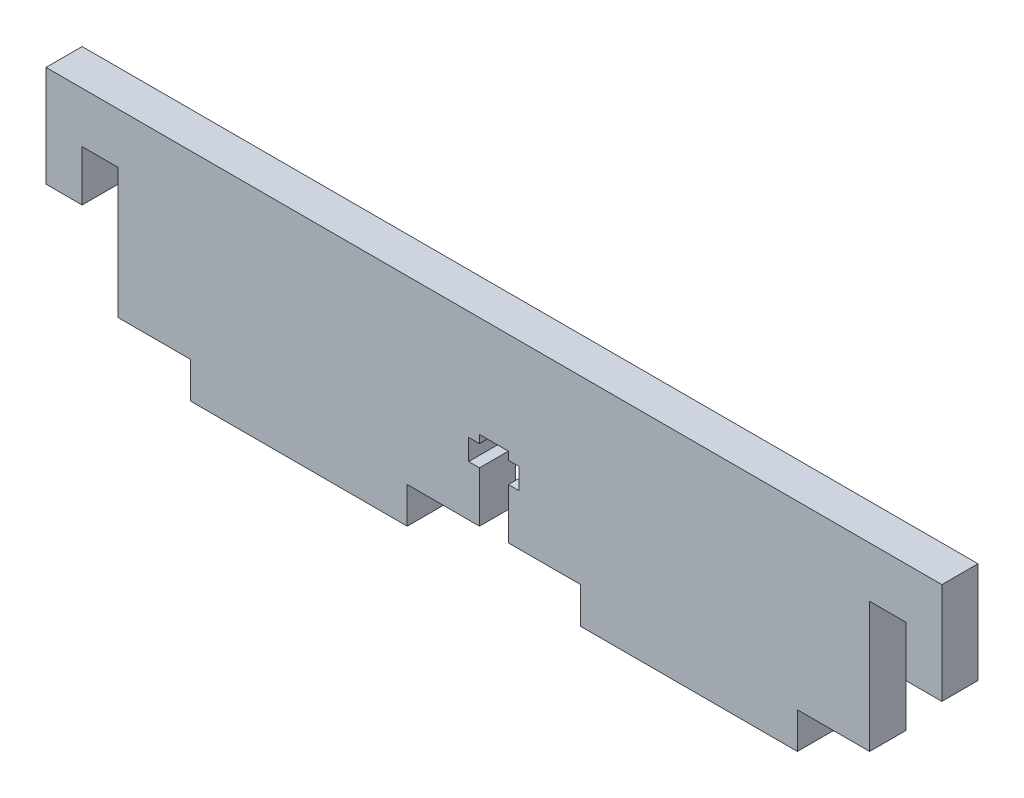
ISO-10303-21;
HEADER;
FILE_DESCRIPTION(('STEP AP214'),'2;1');
FILE_NAME('part.step','',(''),(''),'','','');
FILE_SCHEMA(('AUTOMOTIVE_DESIGN { 1 0 10303 214 1 1 1 1 }'));
ENDSEC;
DATA;
#1=APPLICATION_CONTEXT('core data for automotive mechanical design processes');
#2=APPLICATION_PROTOCOL_DEFINITION('international standard','automotive_design',2000,#1);
#3=PRODUCT_CONTEXT('',#1,'mechanical');
#4=PRODUCT('Part','Part','',(#3));
#5=PRODUCT_RELATED_PRODUCT_CATEGORY('part','',(#4));
#6=PRODUCT_DEFINITION_FORMATION('','',#4);
#7=PRODUCT_DEFINITION_CONTEXT('part definition',#1,'design');
#8=PRODUCT_DEFINITION('design','',#6,#7);
#9=PRODUCT_DEFINITION_SHAPE('','',#8);
#10=(LENGTH_UNIT() NAMED_UNIT(*) SI_UNIT(.MILLI.,.METRE.));
#11=(NAMED_UNIT(*) PLANE_ANGLE_UNIT() SI_UNIT($,.RADIAN.));
#12=(NAMED_UNIT(*) SI_UNIT($,.STERADIAN.) SOLID_ANGLE_UNIT());
#13=UNCERTAINTY_MEASURE_WITH_UNIT(LENGTH_MEASURE(1.E-05),#10,'distance_accuracy_value','');
#14=(GEOMETRIC_REPRESENTATION_CONTEXT(3) GLOBAL_UNCERTAINTY_ASSIGNED_CONTEXT((#13)) GLOBAL_UNIT_ASSIGNED_CONTEXT((#10,
#11,#12)) REPRESENTATION_CONTEXT('',''));
#15=CARTESIAN_POINT('',(0.,0.,0.));
#16=DIRECTION('',(0.,0.,1.));
#17=DIRECTION('',(1.,0.,0.));
#18=AXIS2_PLACEMENT_3D('',#15,#16,#17);
#19=CARTESIAN_POINT('',(0.,25.,5.));
#20=DIRECTION('',(0.,-1.,0.));
#21=DIRECTION('',(0.,0.,-1.));
#22=AXIS2_PLACEMENT_3D('',#19,#20,#21);
#23=PLANE('',#22);
#24=DIRECTION('',(-1.,0.,0.));
#25=VECTOR('',#24,1.);
#26=CARTESIAN_POINT('',(0.,25.,0.));
#27=LINE('',#26,#25);
#28=CARTESIAN_POINT('',(10.,25.,0.));
#29=VERTEX_POINT('',#28);
#30=CARTESIAN_POINT('',(-114.,25.,0.));
#31=VERTEX_POINT('',#30);
#32=EDGE_CURVE('E287',#29,#31,#27,.T.);
#33=ORIENTED_EDGE('',*,*,#32,.T.);
#34=DIRECTION('',(0.,0.,-1.));
#35=VECTOR('',#34,1.);
#36=CARTESIAN_POINT('',(-114.,25.,5.));
#37=LINE('',#36,#35);
#38=CARTESIAN_POINT('',(-114.,25.,5.));
#39=VERTEX_POINT('',#38);
#40=EDGE_CURVE('E11',#39,#31,#37,.T.);
#41=ORIENTED_EDGE('',*,*,#40,.F.);
#42=DIRECTION('',(-1.,0.,0.));
#43=VECTOR('',#42,1.);
#44=CARTESIAN_POINT('',(0.,25.,5.));
#45=LINE('',#44,#43);
#46=CARTESIAN_POINT('',(10.,25.,5.));
#47=VERTEX_POINT('',#46);
#48=EDGE_CURVE('E392',#47,#39,#45,.T.);
#49=ORIENTED_EDGE('',*,*,#48,.F.);
#50=DIRECTION('',(0.,0.,-1.));
#51=VECTOR('',#50,1.);
#52=CARTESIAN_POINT('',(10.,25.,5.));
#53=LINE('',#52,#51);
#54=EDGE_CURVE('E58',#47,#29,#53,.T.);
#55=ORIENTED_EDGE('',*,*,#54,.T.);
#56=EDGE_LOOP('',(#33,#41,#49,#55));
#57=FACE_BOUND('',#56,.T.);
#58=ADVANCED_FACE('F41',(#57),#23,.F.);
#59=CARTESIAN_POINT('',(-114.,0.,5.));
#60=DIRECTION('',(1.,0.,0.));
#61=DIRECTION('',(0.,0.,-1.));
#62=AXIS2_PLACEMENT_3D('',#59,#60,#61);
#63=PLANE('',#62);
#64=DIRECTION('',(0.,-1.,0.));
#65=VECTOR('',#64,1.);
#66=CARTESIAN_POINT('',(-114.,0.,0.));
#67=LINE('',#66,#65);
#68=CARTESIAN_POINT('',(-114.,11.,0.));
#69=VERTEX_POINT('',#68);
#70=EDGE_CURVE('E290',#31,#69,#67,.T.);
#71=ORIENTED_EDGE('',*,*,#70,.T.);
#72=DIRECTION('',(0.,0.,-1.));
#73=VECTOR('',#72,1.);
#74=CARTESIAN_POINT('',(-114.,11.,5.));
#75=LINE('',#74,#73);
#76=CARTESIAN_POINT('',(-114.,11.,5.));
#77=VERTEX_POINT('',#76);
#78=EDGE_CURVE('E50',#77,#69,#75,.T.);
#79=ORIENTED_EDGE('',*,*,#78,.F.);
#80=DIRECTION('',(0.,-1.,0.));
#81=VECTOR('',#80,1.);
#82=CARTESIAN_POINT('',(-114.,0.,5.));
#83=LINE('',#82,#81);
#84=EDGE_CURVE('E168',#39,#77,#83,.T.);
#85=ORIENTED_EDGE('',*,*,#84,.F.);
#86=ORIENTED_EDGE('',*,*,#40,.T.);
#87=EDGE_LOOP('',(#71,#79,#85,#86));
#88=FACE_BOUND('',#87,.T.);
#89=ADVANCED_FACE('F613',(#88),#63,.F.);
#90=CARTESIAN_POINT('',(0.,11.,5.));
#91=DIRECTION('',(0.,1.,0.));
#92=DIRECTION('',(0.,0.,1.));
#93=AXIS2_PLACEMENT_3D('',#90,#91,#92);
#94=PLANE('',#93);
#95=DIRECTION('',(1.,0.,0.));
#96=VECTOR('',#95,1.);
#97=CARTESIAN_POINT('',(0.,11.,0.));
#98=LINE('',#97,#96);
#99=CARTESIAN_POINT('',(-109.,11.,0.));
#100=VERTEX_POINT('',#99);
#101=EDGE_CURVE('E293',#69,#100,#98,.T.);
#102=ORIENTED_EDGE('',*,*,#101,.T.);
#103=DIRECTION('',(0.,0.,-1.));
#104=VECTOR('',#103,1.);
#105=CARTESIAN_POINT('',(-109.,11.,5.));
#106=LINE('',#105,#104);
#107=CARTESIAN_POINT('',(-109.,11.,5.));
#108=VERTEX_POINT('',#107);
#109=EDGE_CURVE('E480',#108,#100,#106,.T.);
#110=ORIENTED_EDGE('',*,*,#109,.F.);
#111=DIRECTION('',(1.,0.,0.));
#112=VECTOR('',#111,1.);
#113=CARTESIAN_POINT('',(0.,11.,5.));
#114=LINE('',#113,#112);
#115=EDGE_CURVE('E489',#77,#108,#114,.T.);
#116=ORIENTED_EDGE('',*,*,#115,.F.);
#117=ORIENTED_EDGE('',*,*,#78,.T.);
#118=EDGE_LOOP('',(#102,#110,#116,#117));
#119=FACE_BOUND('',#118,.T.);
#120=ADVANCED_FACE('F487',(#119),#94,.F.);
#121=CARTESIAN_POINT('',(-109.,0.,5.));
#122=DIRECTION('',(1.,0.,0.));
#123=DIRECTION('',(0.,0.,-1.));
#124=AXIS2_PLACEMENT_3D('',#121,#122,#123);
#125=PLANE('',#124);
#126=DIRECTION('',(0.,-1.,0.));
#127=VECTOR('',#126,1.);
#128=CARTESIAN_POINT('',(-109.,0.,0.));
#129=LINE('',#128,#127);
#130=CARTESIAN_POINT('',(-109.,18.,0.));
#131=VERTEX_POINT('',#130);
#132=EDGE_CURVE('E297',#131,#100,#129,.T.);
#133=ORIENTED_EDGE('',*,*,#132,.F.);
#134=DIRECTION('',(0.,0.,-1.));
#135=VECTOR('',#134,1.);
#136=CARTESIAN_POINT('',(-109.,18.,5.));
#137=LINE('',#136,#135);
#138=CARTESIAN_POINT('',(-109.,18.,5.));
#139=VERTEX_POINT('',#138);
#140=EDGE_CURVE('E477',#139,#131,#137,.T.);
#141=ORIENTED_EDGE('',*,*,#140,.F.);
#142=DIRECTION('',(0.,-1.,0.));
#143=VECTOR('',#142,1.);
#144=CARTESIAN_POINT('',(-109.,0.,5.));
#145=LINE('',#144,#143);
#146=EDGE_CURVE('E498',#139,#108,#145,.T.);
#147=ORIENTED_EDGE('',*,*,#146,.T.);
#148=ORIENTED_EDGE('',*,*,#109,.T.);
#149=EDGE_LOOP('',(#133,#141,#147,#148));
#150=FACE_BOUND('',#149,.T.);
#151=ADVANCED_FACE('F495',(#150),#125,.T.);
#152=CARTESIAN_POINT('',(0.,18.0000000000001,5.));
#153=DIRECTION('',(0.,-1.,0.));
#154=DIRECTION('',(1.,0.,0.));
#155=AXIS2_PLACEMENT_3D('',#152,#153,#154);
#156=PLANE('',#155);
#157=DIRECTION('',(-1.,0.,0.));
#158=VECTOR('',#157,1.);
#159=CARTESIAN_POINT('',(0.,18.0000000000001,0.));
#160=LINE('',#159,#158);
#161=CARTESIAN_POINT('',(-104.,18.,0.));
#162=VERTEX_POINT('',#161);
#163=EDGE_CURVE('E301',#162,#131,#160,.T.);
#164=ORIENTED_EDGE('',*,*,#163,.F.);
#165=DIRECTION('',(0.,0.,-1.));
#166=VECTOR('',#165,1.);
#167=CARTESIAN_POINT('',(-104.,18.,5.));
#168=LINE('',#167,#166);
#169=CARTESIAN_POINT('',(-104.,18.,5.));
#170=VERTEX_POINT('',#169);
#171=EDGE_CURVE('E474',#170,#162,#168,.T.);
#172=ORIENTED_EDGE('',*,*,#171,.F.);
#173=DIRECTION('',(-1.,0.,0.));
#174=VECTOR('',#173,1.);
#175=CARTESIAN_POINT('',(0.,18.0000000000001,5.));
#176=LINE('',#175,#174);
#177=EDGE_CURVE('E502',#170,#139,#176,.T.);
#178=ORIENTED_EDGE('',*,*,#177,.T.);
#179=ORIENTED_EDGE('',*,*,#140,.T.);
#180=EDGE_LOOP('',(#164,#172,#178,#179));
#181=FACE_BOUND('',#180,.T.);
#182=ADVANCED_FACE('F623',(#181),#156,.T.);
#183=CARTESIAN_POINT('',(-104.,0.,5.));
#184=DIRECTION('',(-1.,0.,0.));
#185=DIRECTION('',(0.,-1.,0.));
#186=AXIS2_PLACEMENT_3D('',#183,#184,#185);
#187=PLANE('',#186);
#188=DIRECTION('',(0.,1.,0.));
#189=VECTOR('',#188,1.);
#190=CARTESIAN_POINT('',(-104.,0.,0.));
#191=LINE('',#190,#189);
#192=CARTESIAN_POINT('',(-104.,0.,0.));
#193=VERTEX_POINT('',#192);
#194=EDGE_CURVE('E305',#193,#162,#191,.T.);
#195=ORIENTED_EDGE('',*,*,#194,.F.);
#196=DIRECTION('',(0.,0.,-1.));
#197=VECTOR('',#196,1.);
#198=CARTESIAN_POINT('',(-104.,0.,5.));
#199=LINE('',#198,#197);
#200=CARTESIAN_POINT('',(-104.,0.,5.));
#201=VERTEX_POINT('',#200);
#202=EDGE_CURVE('E471',#201,#193,#199,.T.);
#203=ORIENTED_EDGE('',*,*,#202,.F.);
#204=DIRECTION('',(0.,1.,0.));
#205=VECTOR('',#204,1.);
#206=CARTESIAN_POINT('',(-104.,0.,5.));
#207=LINE('',#206,#205);
#208=EDGE_CURVE('E506',#201,#170,#207,.T.);
#209=ORIENTED_EDGE('',*,*,#208,.T.);
#210=ORIENTED_EDGE('',*,*,#171,.T.);
#211=EDGE_LOOP('',(#195,#203,#209,#210));
#212=FACE_BOUND('',#211,.T.);
#213=ADVANCED_FACE('F626',(#212),#187,.T.);
#214=CARTESIAN_POINT('',(0.,0.,5.));
#215=DIRECTION('',(0.,-1.,0.));
#216=DIRECTION('',(1.,0.,0.));
#217=AXIS2_PLACEMENT_3D('',#214,#215,#216);
#218=PLANE('',#217);
#219=DIRECTION('',(-1.,0.,0.));
#220=VECTOR('',#219,1.);
#221=CARTESIAN_POINT('',(0.,0.,0.));
#222=LINE('',#221,#220);
#223=CARTESIAN_POINT('',(-94.,0.,0.));
#224=VERTEX_POINT('',#223);
#225=EDGE_CURVE('E309',#224,#193,#222,.T.);
#226=ORIENTED_EDGE('',*,*,#225,.F.);
#227=DIRECTION('',(0.,0.,-1.));
#228=VECTOR('',#227,1.);
#229=CARTESIAN_POINT('',(-94.,0.,5.));
#230=LINE('',#229,#228);
#231=CARTESIAN_POINT('',(-94.,0.,5.));
#232=VERTEX_POINT('',#231);
#233=EDGE_CURVE('E468',#232,#224,#230,.T.);
#234=ORIENTED_EDGE('',*,*,#233,.F.);
#235=DIRECTION('',(-1.,0.,0.));
#236=VECTOR('',#235,1.);
#237=CARTESIAN_POINT('',(0.,0.,5.));
#238=LINE('',#237,#236);
#239=EDGE_CURVE('E514',#232,#201,#238,.T.);
#240=ORIENTED_EDGE('',*,*,#239,.T.);
#241=ORIENTED_EDGE('',*,*,#202,.T.);
#242=EDGE_LOOP('',(#226,#234,#240,#241));
#243=FACE_BOUND('',#242,.T.);
#244=ADVANCED_FACE('F630',(#243),#218,.T.);
#245=CARTESIAN_POINT('',(-94.,0.,5.));
#246=DIRECTION('',(1.,0.,0.));
#247=DIRECTION('',(0.,0.,-1.));
#248=AXIS2_PLACEMENT_3D('',#245,#246,#247);
#249=PLANE('',#248);
#250=DIRECTION('',(0.,-1.,0.));
#251=VECTOR('',#250,1.);
#252=CARTESIAN_POINT('',(-94.,0.,0.));
#253=LINE('',#252,#251);
#254=CARTESIAN_POINT('',(-94.,-5.00000000000002,0.));
#255=VERTEX_POINT('',#254);
#256=EDGE_CURVE('E313',#224,#255,#253,.T.);
#257=ORIENTED_EDGE('',*,*,#256,.T.);
#258=DIRECTION('',(0.,0.,-1.));
#259=VECTOR('',#258,1.);
#260=CARTESIAN_POINT('',(-94.,-5.00000000000002,5.));
#261=LINE('',#260,#259);
#262=CARTESIAN_POINT('',(-94.,-5.00000000000002,5.));
#263=VERTEX_POINT('',#262);
#264=EDGE_CURVE('E464',#263,#255,#261,.T.);
#265=ORIENTED_EDGE('',*,*,#264,.F.);
#266=DIRECTION('',(0.,-1.,0.));
#267=VECTOR('',#266,1.);
#268=CARTESIAN_POINT('',(-94.,0.,5.));
#269=LINE('',#268,#267);
#270=EDGE_CURVE('E518',#232,#263,#269,.T.);
#271=ORIENTED_EDGE('',*,*,#270,.F.);
#272=ORIENTED_EDGE('',*,*,#233,.T.);
#273=EDGE_LOOP('',(#257,#265,#271,#272));
#274=FACE_BOUND('',#273,.T.);
#275=ADVANCED_FACE('F632',(#274),#249,.F.);
#276=CARTESIAN_POINT('',(0.,-5.00000000000002,5.));
#277=DIRECTION('',(0.,1.,0.));
#278=DIRECTION('',(0.,0.,1.));
#279=AXIS2_PLACEMENT_3D('',#276,#277,#278);
#280=PLANE('',#279);
#281=DIRECTION('',(1.,0.,0.));
#282=VECTOR('',#281,1.);
#283=CARTESIAN_POINT('',(0.,-5.00000000000002,0.));
#284=LINE('',#283,#282);
#285=CARTESIAN_POINT('',(-64.,-5.00000000000002,0.));
#286=VERTEX_POINT('',#285);
#287=EDGE_CURVE('E317',#255,#286,#284,.T.);
#288=ORIENTED_EDGE('',*,*,#287,.T.);
#289=DIRECTION('',(0.,0.,-1.));
#290=VECTOR('',#289,1.);
#291=CARTESIAN_POINT('',(-64.,-5.00000000000002,5.));
#292=LINE('',#291,#290);
#293=CARTESIAN_POINT('',(-64.,-5.00000000000002,5.));
#294=VERTEX_POINT('',#293);
#295=EDGE_CURVE('E461',#294,#286,#292,.T.);
#296=ORIENTED_EDGE('',*,*,#295,.F.);
#297=DIRECTION('',(1.,0.,0.));
#298=VECTOR('',#297,1.);
#299=CARTESIAN_POINT('',(0.,-5.00000000000002,5.));
#300=LINE('',#299,#298);
#301=EDGE_CURVE('E522',#263,#294,#300,.T.);
#302=ORIENTED_EDGE('',*,*,#301,.F.);
#303=ORIENTED_EDGE('',*,*,#264,.T.);
#304=EDGE_LOOP('',(#288,#296,#302,#303));
#305=FACE_BOUND('',#304,.T.);
#306=ADVANCED_FACE('F635',(#305),#280,.F.);
#307=CARTESIAN_POINT('',(-64.,0.,5.));
#308=DIRECTION('',(1.,0.,0.));
#309=DIRECTION('',(0.,0.,-1.));
#310=AXIS2_PLACEMENT_3D('',#307,#308,#309);
#311=PLANE('',#310);
#312=DIRECTION('',(0.,-1.,0.));
#313=VECTOR('',#312,1.);
#314=CARTESIAN_POINT('',(-64.,0.,0.));
#315=LINE('',#314,#313);
#316=CARTESIAN_POINT('',(-64.,0.,0.));
#317=VERTEX_POINT('',#316);
#318=EDGE_CURVE('E321',#317,#286,#315,.T.);
#319=ORIENTED_EDGE('',*,*,#318,.F.);
#320=DIRECTION('',(0.,0.,-1.));
#321=VECTOR('',#320,1.);
#322=CARTESIAN_POINT('',(-64.,0.,5.));
#323=LINE('',#322,#321);
#324=CARTESIAN_POINT('',(-64.,0.,5.));
#325=VERTEX_POINT('',#324);
#326=EDGE_CURVE('E458',#325,#317,#323,.T.);
#327=ORIENTED_EDGE('',*,*,#326,.F.);
#328=DIRECTION('',(0.,-1.,0.));
#329=VECTOR('',#328,1.);
#330=CARTESIAN_POINT('',(-64.,0.,5.));
#331=LINE('',#330,#329);
#332=EDGE_CURVE('E525',#325,#294,#331,.T.);
#333=ORIENTED_EDGE('',*,*,#332,.T.);
#334=ORIENTED_EDGE('',*,*,#295,.T.);
#335=EDGE_LOOP('',(#319,#327,#333,#334));
#336=FACE_BOUND('',#335,.T.);
#337=ADVANCED_FACE('F599',(#336),#311,.T.);
#338=CARTESIAN_POINT('',(-54.,0.,0.));
#339=VERTEX_POINT('',#338);
#340=EDGE_CURVE('E314',#339,#317,#222,.T.);
#341=ORIENTED_EDGE('',*,*,#340,.F.);
#342=DIRECTION('',(0.,0.,-1.));
#343=VECTOR('',#342,1.);
#344=CARTESIAN_POINT('',(-54.,0.,5.));
#345=LINE('',#344,#343);
#346=CARTESIAN_POINT('',(-54.,0.,5.));
#347=VERTEX_POINT('',#346);
#348=EDGE_CURVE('E455',#347,#339,#345,.T.);
#349=ORIENTED_EDGE('',*,*,#348,.F.);
#350=EDGE_CURVE('E519',#347,#325,#238,.T.);
#351=ORIENTED_EDGE('',*,*,#350,.T.);
#352=ORIENTED_EDGE('',*,*,#326,.T.);
#353=EDGE_LOOP('',(#341,#349,#351,#352));
#354=FACE_BOUND('',#353,.T.);
#355=ADVANCED_FACE('F590',(#354),#218,.T.);
#356=CARTESIAN_POINT('',(-54.,0.,5.));
#357=DIRECTION('',(-1.,0.,0.));
#358=DIRECTION('',(0.,0.,1.));
#359=AXIS2_PLACEMENT_3D('',#356,#357,#358);
#360=PLANE('',#359);
#361=DIRECTION('',(0.,1.,0.));
#362=VECTOR('',#361,1.);
#363=CARTESIAN_POINT('',(-54.,0.,0.));
#364=LINE('',#363,#362);
#365=CARTESIAN_POINT('',(-54.,7.,0.));
#366=VERTEX_POINT('',#365);
#367=EDGE_CURVE('E325',#339,#366,#364,.T.);
#368=ORIENTED_EDGE('',*,*,#367,.T.);
#369=DIRECTION('',(0.,0.,-1.));
#370=VECTOR('',#369,1.);
#371=CARTESIAN_POINT('',(-54.,7.,5.));
#372=LINE('',#371,#370);
#373=CARTESIAN_POINT('',(-54.,7.,5.));
#374=VERTEX_POINT('',#373);
#375=EDGE_CURVE('E452',#374,#366,#372,.T.);
#376=ORIENTED_EDGE('',*,*,#375,.F.);
#377=DIRECTION('',(0.,1.,0.));
#378=VECTOR('',#377,1.);
#379=CARTESIAN_POINT('',(-54.,0.,5.));
#380=LINE('',#379,#378);
#381=EDGE_CURVE('E529',#347,#374,#380,.T.);
#382=ORIENTED_EDGE('',*,*,#381,.F.);
#383=ORIENTED_EDGE('',*,*,#348,.T.);
#384=EDGE_LOOP('',(#368,#376,#382,#383));
#385=FACE_BOUND('',#384,.T.);
#386=ADVANCED_FACE('F644',(#385),#360,.F.);
#387=CARTESIAN_POINT('',(0.,7.,5.));
#388=DIRECTION('',(0.,1.,0.));
#389=DIRECTION('',(0.,0.,1.));
#390=AXIS2_PLACEMENT_3D('',#387,#388,#389);
#391=PLANE('',#390);
#392=DIRECTION('',(1.,0.,0.));
#393=VECTOR('',#392,1.);
#394=CARTESIAN_POINT('',(0.,7.,0.));
#395=LINE('',#394,#393);
#396=CARTESIAN_POINT('',(-55.5,7.,0.));
#397=VERTEX_POINT('',#396);
#398=EDGE_CURVE('E329',#397,#366,#395,.T.);
#399=ORIENTED_EDGE('',*,*,#398,.F.);
#400=DIRECTION('',(0.,0.,-1.));
#401=VECTOR('',#400,1.);
#402=CARTESIAN_POINT('',(-55.5,7.,5.));
#403=LINE('',#402,#401);
#404=CARTESIAN_POINT('',(-55.5,7.,5.));
#405=VERTEX_POINT('',#404);
#406=EDGE_CURVE('E449',#405,#397,#403,.T.);
#407=ORIENTED_EDGE('',*,*,#406,.F.);
#408=DIRECTION('',(1.,0.,0.));
#409=VECTOR('',#408,1.);
#410=CARTESIAN_POINT('',(0.,7.,5.));
#411=LINE('',#410,#409);
#412=EDGE_CURVE('E532',#405,#374,#411,.T.);
#413=ORIENTED_EDGE('',*,*,#412,.T.);
#414=ORIENTED_EDGE('',*,*,#375,.T.);
#415=EDGE_LOOP('',(#399,#407,#413,#414));
#416=FACE_BOUND('',#415,.T.);
#417=ADVANCED_FACE('F645',(#416),#391,.T.);
#418=CARTESIAN_POINT('',(-55.5,0.,5.));
#419=DIRECTION('',(1.,0.,0.));
#420=DIRECTION('',(0.,0.,-1.));
#421=AXIS2_PLACEMENT_3D('',#418,#419,#420);
#422=PLANE('',#421);
#423=DIRECTION('',(0.,-1.,0.));
#424=VECTOR('',#423,1.);
#425=CARTESIAN_POINT('',(-55.5,0.,0.));
#426=LINE('',#425,#424);
#427=CARTESIAN_POINT('',(-55.5,9.9,0.));
#428=VERTEX_POINT('',#427);
#429=EDGE_CURVE('E334',#428,#397,#426,.T.);
#430=ORIENTED_EDGE('',*,*,#429,.F.);
#431=DIRECTION('',(0.,0.,-1.));
#432=VECTOR('',#431,1.);
#433=CARTESIAN_POINT('',(-55.5,9.9,5.));
#434=LINE('',#433,#432);
#435=CARTESIAN_POINT('',(-55.5,9.9,5.));
#436=VERTEX_POINT('',#435);
#437=EDGE_CURVE('E446',#436,#428,#434,.T.);
#438=ORIENTED_EDGE('',*,*,#437,.F.);
#439=DIRECTION('',(0.,-1.,0.));
#440=VECTOR('',#439,1.);
#441=CARTESIAN_POINT('',(-55.5,0.,5.));
#442=LINE('',#441,#440);
#443=EDGE_CURVE('E537',#436,#405,#442,.T.);
#444=ORIENTED_EDGE('',*,*,#443,.T.);
#445=ORIENTED_EDGE('',*,*,#406,.T.);
#446=EDGE_LOOP('',(#430,#438,#444,#445));
#447=FACE_BOUND('',#446,.T.);
#448=ADVANCED_FACE('F648',(#447),#422,.T.);
#449=CARTESIAN_POINT('',(0.,9.90000000000006,5.));
#450=DIRECTION('',(0.,1.,0.));
#451=DIRECTION('',(-1.,0.,0.));
#452=AXIS2_PLACEMENT_3D('',#449,#450,#451);
#453=PLANE('',#452);
#454=DIRECTION('',(1.,0.,0.));
#455=VECTOR('',#454,1.);
#456=CARTESIAN_POINT('',(0.,9.90000000000006,0.));
#457=LINE('',#456,#455);
#458=CARTESIAN_POINT('',(-54.,9.9,0.));
#459=VERTEX_POINT('',#458);
#460=EDGE_CURVE('E338',#428,#459,#457,.T.);
#461=ORIENTED_EDGE('',*,*,#460,.T.);
#462=DIRECTION('',(0.,0.,-1.));
#463=VECTOR('',#462,1.);
#464=CARTESIAN_POINT('',(-54.,9.9,5.));
#465=LINE('',#464,#463);
#466=CARTESIAN_POINT('',(-54.,9.9,5.));
#467=VERTEX_POINT('',#466);
#468=EDGE_CURVE('E442',#467,#459,#465,.T.);
#469=ORIENTED_EDGE('',*,*,#468,.F.);
#470=DIRECTION('',(1.,0.,0.));
#471=VECTOR('',#470,1.);
#472=CARTESIAN_POINT('',(0.,9.90000000000006,5.));
#473=LINE('',#472,#471);
#474=EDGE_CURVE('E541',#436,#467,#473,.T.);
#475=ORIENTED_EDGE('',*,*,#474,.F.);
#476=ORIENTED_EDGE('',*,*,#437,.T.);
#477=EDGE_LOOP('',(#461,#469,#475,#476));
#478=FACE_BOUND('',#477,.T.);
#479=ADVANCED_FACE('F652',(#478),#453,.F.);
#480=CARTESIAN_POINT('',(-54.,11.,0.));
#481=VERTEX_POINT('',#480);
#482=EDGE_CURVE('E330',#459,#481,#364,.T.);
#483=ORIENTED_EDGE('',*,*,#482,.T.);
#484=DIRECTION('',(0.,0.,-1.));
#485=VECTOR('',#484,1.);
#486=CARTESIAN_POINT('',(-54.,11.,5.));
#487=LINE('',#486,#485);
#488=CARTESIAN_POINT('',(-54.,11.,5.));
#489=VERTEX_POINT('',#488);
#490=EDGE_CURVE('E438',#489,#481,#487,.T.);
#491=ORIENTED_EDGE('',*,*,#490,.F.);
#492=EDGE_CURVE('E533',#467,#489,#380,.T.);
#493=ORIENTED_EDGE('',*,*,#492,.F.);
#494=ORIENTED_EDGE('',*,*,#468,.T.);
#495=EDGE_LOOP('',(#483,#491,#493,#494));
#496=FACE_BOUND('',#495,.T.);
#497=ADVANCED_FACE('F656',(#496),#360,.F.);
#498=CARTESIAN_POINT('',(0.,11.,5.));
#499=DIRECTION('',(0.,1.,0.));
#500=DIRECTION('',(0.,0.,1.));
#501=AXIS2_PLACEMENT_3D('',#498,#499,#500);
#502=PLANE('',#501);
#503=DIRECTION('',(1.,0.,0.));
#504=VECTOR('',#503,1.);
#505=CARTESIAN_POINT('',(0.,11.,0.));
#506=LINE('',#505,#504);
#507=CARTESIAN_POINT('',(-50.,11.,0.));
#508=VERTEX_POINT('',#507);
#509=EDGE_CURVE('E341',#481,#508,#506,.T.);
#510=ORIENTED_EDGE('',*,*,#509,.T.);
#511=DIRECTION('',(0.,0.,-1.));
#512=VECTOR('',#511,1.);
#513=CARTESIAN_POINT('',(-50.,11.,5.));
#514=LINE('',#513,#512);
#515=CARTESIAN_POINT('',(-50.,11.,5.));
#516=VERTEX_POINT('',#515);
#517=EDGE_CURVE('E435',#516,#508,#514,.T.);
#518=ORIENTED_EDGE('',*,*,#517,.F.);
#519=DIRECTION('',(1.,0.,0.));
#520=VECTOR('',#519,1.);
#521=CARTESIAN_POINT('',(0.,11.,5.));
#522=LINE('',#521,#520);
#523=EDGE_CURVE('E544',#489,#516,#522,.T.);
#524=ORIENTED_EDGE('',*,*,#523,.F.);
#525=ORIENTED_EDGE('',*,*,#490,.T.);
#526=EDGE_LOOP('',(#510,#518,#524,#525));
#527=FACE_BOUND('',#526,.T.);
#528=ADVANCED_FACE('F660',(#527),#502,.F.);
#529=CARTESIAN_POINT('',(-50.,0.,5.));
#530=DIRECTION('',(-1.,0.,0.));
#531=DIRECTION('',(0.,0.,1.));
#532=AXIS2_PLACEMENT_3D('',#529,#530,#531);
#533=PLANE('',#532);
#534=DIRECTION('',(0.,1.,0.));
#535=VECTOR('',#534,1.);
#536=CARTESIAN_POINT('',(-50.,0.,0.));
#537=LINE('',#536,#535);
#538=CARTESIAN_POINT('',(-50.,9.9,0.));
#539=VERTEX_POINT('',#538);
#540=EDGE_CURVE('E345',#539,#508,#537,.T.);
#541=ORIENTED_EDGE('',*,*,#540,.F.);
#542=DIRECTION('',(0.,0.,-1.));
#543=VECTOR('',#542,1.);
#544=CARTESIAN_POINT('',(-50.,9.9,5.));
#545=LINE('',#544,#543);
#546=CARTESIAN_POINT('',(-50.,9.9,5.));
#547=VERTEX_POINT('',#546);
#548=EDGE_CURVE('E432',#547,#539,#545,.T.);
#549=ORIENTED_EDGE('',*,*,#548,.F.);
#550=DIRECTION('',(0.,1.,0.));
#551=VECTOR('',#550,1.);
#552=CARTESIAN_POINT('',(-50.,0.,5.));
#553=LINE('',#552,#551);
#554=EDGE_CURVE('E547',#547,#516,#553,.T.);
#555=ORIENTED_EDGE('',*,*,#554,.T.);
#556=ORIENTED_EDGE('',*,*,#517,.T.);
#557=EDGE_LOOP('',(#541,#549,#555,#556));
#558=FACE_BOUND('',#557,.T.);
#559=ADVANCED_FACE('F664',(#558),#533,.T.);
#560=CARTESIAN_POINT('',(0.,9.90000000000006,5.));
#561=DIRECTION('',(0.,1.,0.));
#562=DIRECTION('',(-1.,0.,0.));
#563=AXIS2_PLACEMENT_3D('',#560,#561,#562);
#564=PLANE('',#563);
#565=DIRECTION('',(1.,0.,0.));
#566=VECTOR('',#565,1.);
#567=CARTESIAN_POINT('',(0.,9.90000000000006,0.));
#568=LINE('',#567,#566);
#569=CARTESIAN_POINT('',(-48.5,9.90000000000001,0.));
#570=VERTEX_POINT('',#569);
#571=EDGE_CURVE('E349',#539,#570,#568,.T.);
#572=ORIENTED_EDGE('',*,*,#571,.T.);
#573=DIRECTION('',(0.,0.,-1.));
#574=VECTOR('',#573,1.);
#575=CARTESIAN_POINT('',(-48.5,9.90000000000001,5.));
#576=LINE('',#575,#574);
#577=CARTESIAN_POINT('',(-48.5,9.90000000000001,5.));
#578=VERTEX_POINT('',#577);
#579=EDGE_CURVE('E428',#578,#570,#576,.T.);
#580=ORIENTED_EDGE('',*,*,#579,.F.);
#581=DIRECTION('',(1.,0.,0.));
#582=VECTOR('',#581,1.);
#583=CARTESIAN_POINT('',(0.,9.90000000000006,5.));
#584=LINE('',#583,#582);
#585=EDGE_CURVE('E551',#547,#578,#584,.T.);
#586=ORIENTED_EDGE('',*,*,#585,.F.);
#587=ORIENTED_EDGE('',*,*,#548,.T.);
#588=EDGE_LOOP('',(#572,#580,#586,#587));
#589=FACE_BOUND('',#588,.T.);
#590=ADVANCED_FACE('F666',(#589),#564,.F.);
#591=CARTESIAN_POINT('',(-48.5,0.,5.));
#592=DIRECTION('',(1.,0.,0.));
#593=DIRECTION('',(0.,0.,-1.));
#594=AXIS2_PLACEMENT_3D('',#591,#592,#593);
#595=PLANE('',#594);
#596=DIRECTION('',(0.,-1.,0.));
#597=VECTOR('',#596,1.);
#598=CARTESIAN_POINT('',(-48.5,0.,0.));
#599=LINE('',#598,#597);
#600=CARTESIAN_POINT('',(-48.5,7.,0.));
#601=VERTEX_POINT('',#600);
#602=EDGE_CURVE('E353',#570,#601,#599,.T.);
#603=ORIENTED_EDGE('',*,*,#602,.T.);
#604=DIRECTION('',(0.,0.,-1.));
#605=VECTOR('',#604,1.);
#606=CARTESIAN_POINT('',(-48.5,7.,5.));
#607=LINE('',#606,#605);
#608=CARTESIAN_POINT('',(-48.5,7.,5.));
#609=VERTEX_POINT('',#608);
#610=EDGE_CURVE('E425',#609,#601,#607,.T.);
#611=ORIENTED_EDGE('',*,*,#610,.F.);
#612=DIRECTION('',(0.,-1.,0.));
#613=VECTOR('',#612,1.);
#614=CARTESIAN_POINT('',(-48.5,0.,5.));
#615=LINE('',#614,#613);
#616=EDGE_CURVE('E555',#578,#609,#615,.T.);
#617=ORIENTED_EDGE('',*,*,#616,.F.);
#618=ORIENTED_EDGE('',*,*,#579,.T.);
#619=EDGE_LOOP('',(#603,#611,#617,#618));
#620=FACE_BOUND('',#619,.T.);
#621=ADVANCED_FACE('F669',(#620),#595,.F.);
#622=CARTESIAN_POINT('',(0.,7.,5.));
#623=DIRECTION('',(0.,1.,0.));
#624=DIRECTION('',(0.,0.,1.));
#625=AXIS2_PLACEMENT_3D('',#622,#623,#624);
#626=PLANE('',#625);
#627=DIRECTION('',(1.,0.,0.));
#628=VECTOR('',#627,1.);
#629=CARTESIAN_POINT('',(0.,7.,0.));
#630=LINE('',#629,#628);
#631=CARTESIAN_POINT('',(-50.,7.,0.));
#632=VERTEX_POINT('',#631);
#633=EDGE_CURVE('E357',#632,#601,#630,.T.);
#634=ORIENTED_EDGE('',*,*,#633,.F.);
#635=DIRECTION('',(0.,0.,-1.));
#636=VECTOR('',#635,1.);
#637=CARTESIAN_POINT('',(-50.,7.,5.));
#638=LINE('',#637,#636);
#639=CARTESIAN_POINT('',(-50.,7.,5.));
#640=VERTEX_POINT('',#639);
#641=EDGE_CURVE('E422',#640,#632,#638,.T.);
#642=ORIENTED_EDGE('',*,*,#641,.F.);
#643=DIRECTION('',(1.,0.,0.));
#644=VECTOR('',#643,1.);
#645=CARTESIAN_POINT('',(0.,7.,5.));
#646=LINE('',#645,#644);
#647=EDGE_CURVE('E558',#640,#609,#646,.T.);
#648=ORIENTED_EDGE('',*,*,#647,.T.);
#649=ORIENTED_EDGE('',*,*,#610,.T.);
#650=EDGE_LOOP('',(#634,#642,#648,#649));
#651=FACE_BOUND('',#650,.T.);
#652=ADVANCED_FACE('F673',(#651),#626,.T.);
#653=CARTESIAN_POINT('',(-50.,0.,0.));
#654=VERTEX_POINT('',#653);
#655=EDGE_CURVE('E350',#654,#632,#537,.T.);
#656=ORIENTED_EDGE('',*,*,#655,.F.);
#657=DIRECTION('',(0.,0.,-1.));
#658=VECTOR('',#657,1.);
#659=CARTESIAN_POINT('',(-50.,0.,5.));
#660=LINE('',#659,#658);
#661=CARTESIAN_POINT('',(-50.,0.,5.));
#662=VERTEX_POINT('',#661);
#663=EDGE_CURVE('E419',#662,#654,#660,.T.);
#664=ORIENTED_EDGE('',*,*,#663,.F.);
#665=EDGE_CURVE('E552',#662,#640,#553,.T.);
#666=ORIENTED_EDGE('',*,*,#665,.T.);
#667=ORIENTED_EDGE('',*,*,#641,.T.);
#668=EDGE_LOOP('',(#656,#664,#666,#667));
#669=FACE_BOUND('',#668,.T.);
#670=ADVANCED_FACE('F677',(#669),#533,.T.);
#671=CARTESIAN_POINT('',(0.,0.,5.));
#672=DIRECTION('',(0.,-1.,0.));
#673=DIRECTION('',(1.,0.,0.));
#674=AXIS2_PLACEMENT_3D('',#671,#672,#673);
#675=PLANE('',#674);
#676=DIRECTION('',(-1.,0.,0.));
#677=VECTOR('',#676,1.);
#678=CARTESIAN_POINT('',(0.,0.,0.));
#679=LINE('',#678,#677);
#680=CARTESIAN_POINT('',(-40.,0.,0.));
#681=VERTEX_POINT('',#680);
#682=EDGE_CURVE('E361',#681,#654,#679,.T.);
#683=ORIENTED_EDGE('',*,*,#682,.F.);
#684=DIRECTION('',(0.,0.,-1.));
#685=VECTOR('',#684,1.);
#686=CARTESIAN_POINT('',(-40.,0.,5.));
#687=LINE('',#686,#685);
#688=CARTESIAN_POINT('',(-40.,0.,5.));
#689=VERTEX_POINT('',#688);
#690=EDGE_CURVE('E416',#689,#681,#687,.T.);
#691=ORIENTED_EDGE('',*,*,#690,.F.);
#692=DIRECTION('',(-1.,0.,0.));
#693=VECTOR('',#692,1.);
#694=CARTESIAN_POINT('',(0.,0.,5.));
#695=LINE('',#694,#693);
#696=EDGE_CURVE('E562',#689,#662,#695,.T.);
#697=ORIENTED_EDGE('',*,*,#696,.T.);
#698=ORIENTED_EDGE('',*,*,#663,.T.);
#699=EDGE_LOOP('',(#683,#691,#697,#698));
#700=FACE_BOUND('',#699,.T.);
#701=ADVANCED_FACE('F681',(#700),#675,.T.);
#702=CARTESIAN_POINT('',(-40.,0.,5.));
#703=DIRECTION('',(1.,0.,0.));
#704=DIRECTION('',(0.,0.,-1.));
#705=AXIS2_PLACEMENT_3D('',#702,#703,#704);
#706=PLANE('',#705);
#707=DIRECTION('',(0.,-1.,0.));
#708=VECTOR('',#707,1.);
#709=CARTESIAN_POINT('',(-40.,0.,0.));
#710=LINE('',#709,#708);
#711=CARTESIAN_POINT('',(-40.,-5.,0.));
#712=VERTEX_POINT('',#711);
#713=EDGE_CURVE('E365',#681,#712,#710,.T.);
#714=ORIENTED_EDGE('',*,*,#713,.T.);
#715=DIRECTION('',(0.,0.,-1.));
#716=VECTOR('',#715,1.);
#717=CARTESIAN_POINT('',(-40.,-5.,5.));
#718=LINE('',#717,#716);
#719=CARTESIAN_POINT('',(-40.,-5.,5.));
#720=VERTEX_POINT('',#719);
#721=EDGE_CURVE('E412',#720,#712,#718,.T.);
#722=ORIENTED_EDGE('',*,*,#721,.F.);
#723=DIRECTION('',(0.,-1.,0.));
#724=VECTOR('',#723,1.);
#725=CARTESIAN_POINT('',(-40.,0.,5.));
#726=LINE('',#725,#724);
#727=EDGE_CURVE('E566',#689,#720,#726,.T.);
#728=ORIENTED_EDGE('',*,*,#727,.F.);
#729=ORIENTED_EDGE('',*,*,#690,.T.);
#730=EDGE_LOOP('',(#714,#722,#728,#729));
#731=FACE_BOUND('',#730,.T.);
#732=ADVANCED_FACE('F683',(#731),#706,.F.);
#733=CARTESIAN_POINT('',(0.,-5.,5.));
#734=DIRECTION('',(0.,1.,0.));
#735=DIRECTION('',(0.,0.,1.));
#736=AXIS2_PLACEMENT_3D('',#733,#734,#735);
#737=PLANE('',#736);
#738=DIRECTION('',(1.,0.,0.));
#739=VECTOR('',#738,1.);
#740=CARTESIAN_POINT('',(0.,-5.,0.));
#741=LINE('',#740,#739);
#742=CARTESIAN_POINT('',(-10.,-5.,0.));
#743=VERTEX_POINT('',#742);
#744=EDGE_CURVE('E369',#712,#743,#741,.T.);
#745=ORIENTED_EDGE('',*,*,#744,.T.);
#746=DIRECTION('',(0.,0.,-1.));
#747=VECTOR('',#746,1.);
#748=CARTESIAN_POINT('',(-10.,-5.,5.));
#749=LINE('',#748,#747);
#750=CARTESIAN_POINT('',(-10.,-5.,5.));
#751=VERTEX_POINT('',#750);
#752=EDGE_CURVE('E409',#751,#743,#749,.T.);
#753=ORIENTED_EDGE('',*,*,#752,.F.);
#754=DIRECTION('',(1.,0.,0.));
#755=VECTOR('',#754,1.);
#756=CARTESIAN_POINT('',(0.,-5.,5.));
#757=LINE('',#756,#755);
#758=EDGE_CURVE('E570',#720,#751,#757,.T.);
#759=ORIENTED_EDGE('',*,*,#758,.F.);
#760=ORIENTED_EDGE('',*,*,#721,.T.);
#761=EDGE_LOOP('',(#745,#753,#759,#760));
#762=FACE_BOUND('',#761,.T.);
#763=ADVANCED_FACE('F686',(#762),#737,.F.);
#764=CARTESIAN_POINT('',(-10.,0.,5.));
#765=DIRECTION('',(1.,0.,0.));
#766=DIRECTION('',(0.,0.,-1.));
#767=AXIS2_PLACEMENT_3D('',#764,#765,#766);
#768=PLANE('',#767);
#769=DIRECTION('',(0.,-1.,0.));
#770=VECTOR('',#769,1.);
#771=CARTESIAN_POINT('',(-10.,0.,0.));
#772=LINE('',#771,#770);
#773=CARTESIAN_POINT('',(-10.,0.,0.));
#774=VERTEX_POINT('',#773);
#775=EDGE_CURVE('E373',#774,#743,#772,.T.);
#776=ORIENTED_EDGE('',*,*,#775,.F.);
#777=DIRECTION('',(0.,0.,-1.));
#778=VECTOR('',#777,1.);
#779=CARTESIAN_POINT('',(-10.,0.,5.));
#780=LINE('',#779,#778);
#781=CARTESIAN_POINT('',(-10.,0.,5.));
#782=VERTEX_POINT('',#781);
#783=EDGE_CURVE('E406',#782,#774,#780,.T.);
#784=ORIENTED_EDGE('',*,*,#783,.F.);
#785=DIRECTION('',(0.,-1.,0.));
#786=VECTOR('',#785,1.);
#787=CARTESIAN_POINT('',(-10.,0.,5.));
#788=LINE('',#787,#786);
#789=EDGE_CURVE('E573',#782,#751,#788,.T.);
#790=ORIENTED_EDGE('',*,*,#789,.T.);
#791=ORIENTED_EDGE('',*,*,#752,.T.);
#792=EDGE_LOOP('',(#776,#784,#790,#791));
#793=FACE_BOUND('',#792,.T.);
#794=ADVANCED_FACE('F690',(#793),#768,.T.);
#795=CARTESIAN_POINT('',(0.,0.,0.));
#796=VERTEX_POINT('',#795);
#797=EDGE_CURVE('E366',#796,#774,#679,.T.);
#798=ORIENTED_EDGE('',*,*,#797,.F.);
#799=DIRECTION('',(0.,0.,-1.));
#800=VECTOR('',#799,1.);
#801=CARTESIAN_POINT('',(0.,0.,5.));
#802=LINE('',#801,#800);
#803=CARTESIAN_POINT('',(0.,0.,5.));
#804=VERTEX_POINT('',#803);
#805=EDGE_CURVE('E403',#804,#796,#802,.T.);
#806=ORIENTED_EDGE('',*,*,#805,.F.);
#807=EDGE_CURVE('E567',#804,#782,#695,.T.);
#808=ORIENTED_EDGE('',*,*,#807,.T.);
#809=ORIENTED_EDGE('',*,*,#783,.T.);
#810=EDGE_LOOP('',(#798,#806,#808,#809));
#811=FACE_BOUND('',#810,.T.);
#812=ADVANCED_FACE('F694',(#811),#675,.T.);
#813=CARTESIAN_POINT('',(0.,0.,5.));
#814=DIRECTION('',(-1.,0.,0.));
#815=DIRECTION('',(0.,0.,1.));
#816=AXIS2_PLACEMENT_3D('',#813,#814,#815);
#817=PLANE('',#816);
#818=DIRECTION('',(0.,1.,0.));
#819=VECTOR('',#818,1.);
#820=CARTESIAN_POINT('',(0.,0.,0.));
#821=LINE('',#820,#819);
#822=CARTESIAN_POINT('',(0.,18.,0.));
#823=VERTEX_POINT('',#822);
#824=EDGE_CURVE('E377',#796,#823,#821,.T.);
#825=ORIENTED_EDGE('',*,*,#824,.T.);
#826=DIRECTION('',(0.,0.,-1.));
#827=VECTOR('',#826,1.);
#828=CARTESIAN_POINT('',(0.,18.,5.));
#829=LINE('',#828,#827);
#830=CARTESIAN_POINT('',(0.,18.,5.));
#831=VERTEX_POINT('',#830);
#832=EDGE_CURVE('E399',#831,#823,#829,.T.);
#833=ORIENTED_EDGE('',*,*,#832,.F.);
#834=DIRECTION('',(0.,1.,0.));
#835=VECTOR('',#834,1.);
#836=CARTESIAN_POINT('',(0.,0.,5.));
#837=LINE('',#836,#835);
#838=EDGE_CURVE('E577',#804,#831,#837,.T.);
#839=ORIENTED_EDGE('',*,*,#838,.F.);
#840=ORIENTED_EDGE('',*,*,#805,.T.);
#841=EDGE_LOOP('',(#825,#833,#839,#840));
#842=FACE_BOUND('',#841,.T.);
#843=ADVANCED_FACE('F698',(#842),#817,.F.);
#844=CARTESIAN_POINT('',(0.,18.,5.));
#845=DIRECTION('',(0.,1.,0.));
#846=DIRECTION('',(0.,0.,1.));
#847=AXIS2_PLACEMENT_3D('',#844,#845,#846);
#848=PLANE('',#847);
#849=DIRECTION('',(1.,0.,0.));
#850=VECTOR('',#849,1.);
#851=CARTESIAN_POINT('',(0.,18.,0.));
#852=LINE('',#851,#850);
#853=CARTESIAN_POINT('',(5.,18.,0.));
#854=VERTEX_POINT('',#853);
#855=EDGE_CURVE('E380',#823,#854,#852,.T.);
#856=ORIENTED_EDGE('',*,*,#855,.T.);
#857=DIRECTION('',(0.,0.,-1.));
#858=VECTOR('',#857,1.);
#859=CARTESIAN_POINT('',(5.,18.,5.));
#860=LINE('',#859,#858);
#861=CARTESIAN_POINT('',(5.,18.,5.));
#862=VERTEX_POINT('',#861);
#863=EDGE_CURVE('E277',#862,#854,#860,.T.);
#864=ORIENTED_EDGE('',*,*,#863,.F.);
#865=DIRECTION('',(1.,0.,0.));
#866=VECTOR('',#865,1.);
#867=CARTESIAN_POINT('',(0.,18.,5.));
#868=LINE('',#867,#866);
#869=EDGE_CURVE('E263',#831,#862,#868,.T.);
#870=ORIENTED_EDGE('',*,*,#869,.F.);
#871=ORIENTED_EDGE('',*,*,#832,.T.);
#872=EDGE_LOOP('',(#856,#864,#870,#871));
#873=FACE_BOUND('',#872,.T.);
#874=ADVANCED_FACE('F702',(#873),#848,.F.);
#875=CARTESIAN_POINT('',(5.,0.,5.));
#876=DIRECTION('',(1.,0.,0.));
#877=DIRECTION('',(0.,0.,-1.));
#878=AXIS2_PLACEMENT_3D('',#875,#876,#877);
#879=PLANE('',#878);
#880=DIRECTION('',(0.,-1.,0.));
#881=VECTOR('',#880,1.);
#882=CARTESIAN_POINT('',(5.,0.,0.));
#883=LINE('',#882,#881);
#884=CARTESIAN_POINT('',(5.,11.,0.));
#885=VERTEX_POINT('',#884);
#886=EDGE_CURVE('E273',#854,#885,#883,.T.);
#887=ORIENTED_EDGE('',*,*,#886,.T.);
#888=DIRECTION('',(0.,0.,-1.));
#889=VECTOR('',#888,1.);
#890=CARTESIAN_POINT('',(5.,11.,5.));
#891=LINE('',#890,#889);
#892=CARTESIAN_POINT('',(5.,11.,5.));
#893=VERTEX_POINT('',#892);
#894=EDGE_CURVE('E270',#893,#885,#891,.T.);
#895=ORIENTED_EDGE('',*,*,#894,.F.);
#896=DIRECTION('',(0.,-1.,0.));
#897=VECTOR('',#896,1.);
#898=CARTESIAN_POINT('',(5.,0.,5.));
#899=LINE('',#898,#897);
#900=EDGE_CURVE('E256',#862,#893,#899,.T.);
#901=ORIENTED_EDGE('',*,*,#900,.F.);
#902=ORIENTED_EDGE('',*,*,#863,.T.);
#903=EDGE_LOOP('',(#887,#895,#901,#902));
#904=FACE_BOUND('',#903,.T.);
#905=ADVANCED_FACE('F271',(#904),#879,.F.);
#906=CARTESIAN_POINT('',(0.,11.,5.));
#907=DIRECTION('',(0.,-1.,0.));
#908=DIRECTION('',(0.,0.,-1.));
#909=AXIS2_PLACEMENT_3D('',#906,#907,#908);
#910=PLANE('',#909);
#911=DIRECTION('',(-1.,0.,0.));
#912=VECTOR('',#911,1.);
#913=CARTESIAN_POINT('',(0.,11.,0.));
#914=LINE('',#913,#912);
#915=CARTESIAN_POINT('',(10.,11.,0.));
#916=VERTEX_POINT('',#915);
#917=EDGE_CURVE('E385',#916,#885,#914,.T.);
#918=ORIENTED_EDGE('',*,*,#917,.F.);
#919=DIRECTION('',(0.,0.,-1.));
#920=VECTOR('',#919,1.);
#921=CARTESIAN_POINT('',(10.,11.,5.));
#922=LINE('',#921,#920);
#923=CARTESIAN_POINT('',(10.,11.,5.));
#924=VERTEX_POINT('',#923);
#925=EDGE_CURVE('E156',#924,#916,#922,.T.);
#926=ORIENTED_EDGE('',*,*,#925,.F.);
#927=DIRECTION('',(-1.,0.,0.));
#928=VECTOR('',#927,1.);
#929=CARTESIAN_POINT('',(0.,11.,5.));
#930=LINE('',#929,#928);
#931=EDGE_CURVE('E261',#924,#893,#930,.T.);
#932=ORIENTED_EDGE('',*,*,#931,.T.);
#933=ORIENTED_EDGE('',*,*,#894,.T.);
#934=EDGE_LOOP('',(#918,#926,#932,#933));
#935=FACE_BOUND('',#934,.T.);
#936=ADVANCED_FACE('F279',(#935),#910,.T.);
#937=CARTESIAN_POINT('',(10.,0.,5.));
#938=DIRECTION('',(1.,0.,0.));
#939=DIRECTION('',(0.,0.,-1.));
#940=AXIS2_PLACEMENT_3D('',#937,#938,#939);
#941=PLANE('',#940);
#942=DIRECTION('',(0.,-1.,0.));
#943=VECTOR('',#942,1.);
#944=CARTESIAN_POINT('',(10.,0.,0.));
#945=LINE('',#944,#943);
#946=EDGE_CURVE('E388',#29,#916,#945,.T.);
#947=ORIENTED_EDGE('',*,*,#946,.F.);
#948=ORIENTED_EDGE('',*,*,#54,.F.);
#949=DIRECTION('',(0.,-1.,0.));
#950=VECTOR('',#949,1.);
#951=CARTESIAN_POINT('',(10.,0.,5.));
#952=LINE('',#951,#950);
#953=EDGE_CURVE('E281',#47,#924,#952,.T.);
#954=ORIENTED_EDGE('',*,*,#953,.T.);
#955=ORIENTED_EDGE('',*,*,#925,.T.);
#956=EDGE_LOOP('',(#947,#948,#954,#955));
#957=FACE_BOUND('',#956,.T.);
#958=ADVANCED_FACE('F711',(#957),#941,.T.);
#959=CARTESIAN_POINT('',(0.,0.,5.));
#960=DIRECTION('',(0.,0.,1.));
#961=DIRECTION('',(1.,0.,0.));
#962=AXIS2_PLACEMENT_3D('',#959,#960,#961);
#963=PLANE('',#962);
#964=ORIENTED_EDGE('',*,*,#48,.T.);
#965=ORIENTED_EDGE('',*,*,#84,.T.);
#966=ORIENTED_EDGE('',*,*,#115,.T.);
#967=ORIENTED_EDGE('',*,*,#146,.F.);
#968=ORIENTED_EDGE('',*,*,#177,.F.);
#969=ORIENTED_EDGE('',*,*,#208,.F.);
#970=ORIENTED_EDGE('',*,*,#239,.F.);
#971=ORIENTED_EDGE('',*,*,#270,.T.);
#972=ORIENTED_EDGE('',*,*,#301,.T.);
#973=ORIENTED_EDGE('',*,*,#332,.F.);
#974=ORIENTED_EDGE('',*,*,#350,.F.);
#975=ORIENTED_EDGE('',*,*,#381,.T.);
#976=ORIENTED_EDGE('',*,*,#412,.F.);
#977=ORIENTED_EDGE('',*,*,#443,.F.);
#978=ORIENTED_EDGE('',*,*,#474,.T.);
#979=ORIENTED_EDGE('',*,*,#492,.T.);
#980=ORIENTED_EDGE('',*,*,#523,.T.);
#981=ORIENTED_EDGE('',*,*,#554,.F.);
#982=ORIENTED_EDGE('',*,*,#585,.T.);
#983=ORIENTED_EDGE('',*,*,#616,.T.);
#984=ORIENTED_EDGE('',*,*,#647,.F.);
#985=ORIENTED_EDGE('',*,*,#665,.F.);
#986=ORIENTED_EDGE('',*,*,#696,.F.);
#987=ORIENTED_EDGE('',*,*,#727,.T.);
#988=ORIENTED_EDGE('',*,*,#758,.T.);
#989=ORIENTED_EDGE('',*,*,#789,.F.);
#990=ORIENTED_EDGE('',*,*,#807,.F.);
#991=ORIENTED_EDGE('',*,*,#838,.T.);
#992=ORIENTED_EDGE('',*,*,#869,.T.);
#993=ORIENTED_EDGE('',*,*,#900,.T.);
#994=ORIENTED_EDGE('',*,*,#931,.F.);
#995=ORIENTED_EDGE('',*,*,#953,.F.);
#996=EDGE_LOOP('',(#964,#965,#966,#967,#968,#969,#970,#971,#972,#973,#974,#975,#976,#977,#978,
#979,#980,#981,#982,#983,#984,#985,#986,#987,#988,#989,#990,#991,#992,#993,#994,#995));
#997=FACE_BOUND('',#996,.T.);
#998=ADVANCED_FACE('F258',(#997),#963,.T.);
#999=CARTESIAN_POINT('',(0.,0.,0.));
#1000=DIRECTION('',(0.,0.,1.));
#1001=DIRECTION('',(1.,0.,0.));
#1002=AXIS2_PLACEMENT_3D('',#999,#1000,#1001);
#1003=PLANE('',#1002);
#1004=ORIENTED_EDGE('',*,*,#32,.F.);
#1005=ORIENTED_EDGE('',*,*,#946,.T.);
#1006=ORIENTED_EDGE('',*,*,#917,.T.);
#1007=ORIENTED_EDGE('',*,*,#886,.F.);
#1008=ORIENTED_EDGE('',*,*,#855,.F.);
#1009=ORIENTED_EDGE('',*,*,#824,.F.);
#1010=ORIENTED_EDGE('',*,*,#797,.T.);
#1011=ORIENTED_EDGE('',*,*,#775,.T.);
#1012=ORIENTED_EDGE('',*,*,#744,.F.);
#1013=ORIENTED_EDGE('',*,*,#713,.F.);
#1014=ORIENTED_EDGE('',*,*,#682,.T.);
#1015=ORIENTED_EDGE('',*,*,#655,.T.);
#1016=ORIENTED_EDGE('',*,*,#633,.T.);
#1017=ORIENTED_EDGE('',*,*,#602,.F.);
#1018=ORIENTED_EDGE('',*,*,#571,.F.);
#1019=ORIENTED_EDGE('',*,*,#540,.T.);
#1020=ORIENTED_EDGE('',*,*,#509,.F.);
#1021=ORIENTED_EDGE('',*,*,#482,.F.);
#1022=ORIENTED_EDGE('',*,*,#460,.F.);
#1023=ORIENTED_EDGE('',*,*,#429,.T.);
#1024=ORIENTED_EDGE('',*,*,#398,.T.);
#1025=ORIENTED_EDGE('',*,*,#367,.F.);
#1026=ORIENTED_EDGE('',*,*,#340,.T.);
#1027=ORIENTED_EDGE('',*,*,#318,.T.);
#1028=ORIENTED_EDGE('',*,*,#287,.F.);
#1029=ORIENTED_EDGE('',*,*,#256,.F.);
#1030=ORIENTED_EDGE('',*,*,#225,.T.);
#1031=ORIENTED_EDGE('',*,*,#194,.T.);
#1032=ORIENTED_EDGE('',*,*,#163,.T.);
#1033=ORIENTED_EDGE('',*,*,#132,.T.);
#1034=ORIENTED_EDGE('',*,*,#101,.F.);
#1035=ORIENTED_EDGE('',*,*,#70,.F.);
#1036=EDGE_LOOP('',(#1004,#1005,#1006,#1007,#1008,#1009,#1010,#1011,#1012,#1013,#1014,#1015,
#1016,#1017,#1018,#1019,#1020,#1021,#1022,#1023,#1024,#1025,#1026,#1027,#1028,#1029,#1030,#1031,
#1032,#1033,#1034,#1035));
#1037=FACE_BOUND('',#1036,.T.);
#1038=ADVANCED_FACE('F491',(#1037),#1003,.F.);
#1039=CLOSED_SHELL('',(#58,#89,#120,#151,#182,#213,#244,#275,#306,#337,#355,#386,#417,#448,#479,
#497,#528,#559,#590,#621,#652,#670,#701,#732,#763,#794,#812,#843,#874,#905,#936,#958,#998,#1038));
#1040=MANIFOLD_SOLID_BREP('B2',#1039);
#1041=ADVANCED_BREP_SHAPE_REPRESENTATION('',(#18,#1040),#14);
#1042=SHAPE_DEFINITION_REPRESENTATION(#9,#1041);
ENDSEC;
END-ISO-10303-21;
